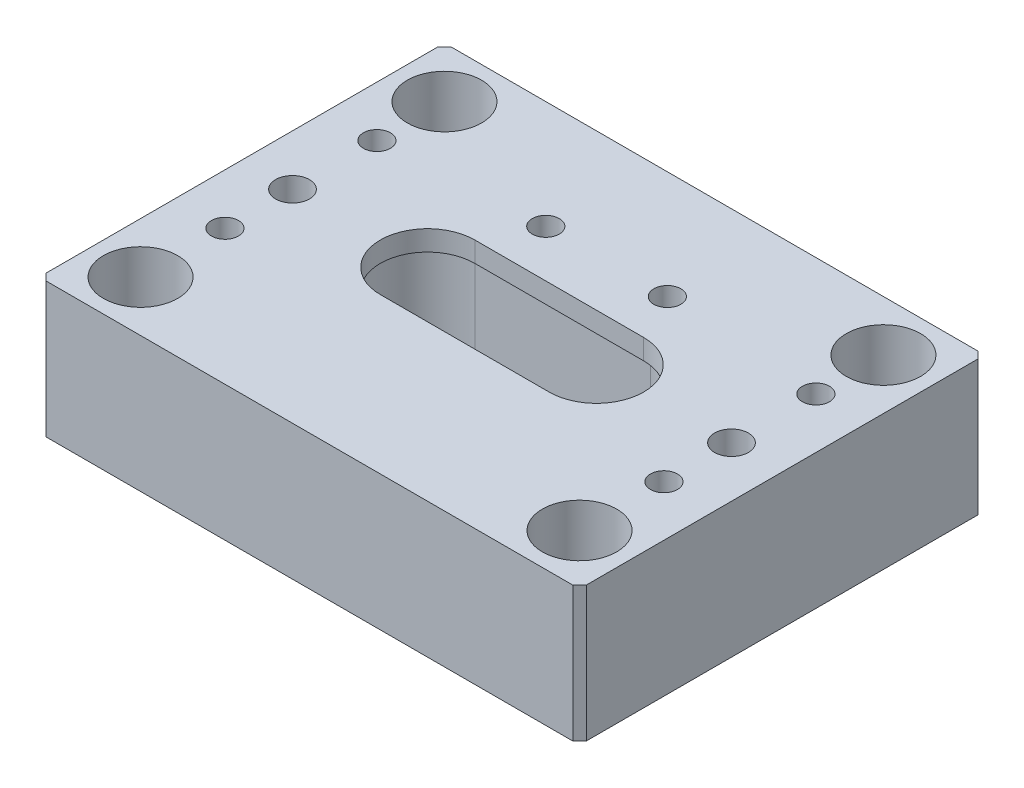
ISO-10303-21;
HEADER;
FILE_DESCRIPTION(('STEP AP214'),'2;1');
FILE_NAME('part.step','',(''),(''),'','','');
FILE_SCHEMA(('AUTOMOTIVE_DESIGN { 1 0 10303 214 1 1 1 1 }'));
ENDSEC;
DATA;
#1=APPLICATION_CONTEXT('core data for automotive mechanical design processes');
#2=APPLICATION_PROTOCOL_DEFINITION('international standard','automotive_design',2000,#1);
#3=PRODUCT_CONTEXT('',#1,'mechanical');
#4=PRODUCT('Part','Part','',(#3));
#5=PRODUCT_RELATED_PRODUCT_CATEGORY('part','',(#4));
#6=PRODUCT_DEFINITION_FORMATION('','',#4);
#7=PRODUCT_DEFINITION_CONTEXT('part definition',#1,'design');
#8=PRODUCT_DEFINITION('design','',#6,#7);
#9=PRODUCT_DEFINITION_SHAPE('','',#8);
#10=(LENGTH_UNIT() NAMED_UNIT(*) SI_UNIT(.MILLI.,.METRE.));
#11=(NAMED_UNIT(*) PLANE_ANGLE_UNIT() SI_UNIT($,.RADIAN.));
#12=(NAMED_UNIT(*) SI_UNIT($,.STERADIAN.) SOLID_ANGLE_UNIT());
#13=UNCERTAINTY_MEASURE_WITH_UNIT(LENGTH_MEASURE(1.E-05),#10,'distance_accuracy_value','');
#14=(GEOMETRIC_REPRESENTATION_CONTEXT(3) GLOBAL_UNCERTAINTY_ASSIGNED_CONTEXT((#13)) GLOBAL_UNIT_ASSIGNED_CONTEXT((#10,
#11,#12)) REPRESENTATION_CONTEXT('',''));
#15=CARTESIAN_POINT('',(0.,0.,0.));
#16=DIRECTION('',(0.,0.,1.));
#17=DIRECTION('',(1.,0.,0.));
#18=AXIS2_PLACEMENT_3D('',#15,#16,#17);
#19=CARTESIAN_POINT('',(-40.,20.,-29.));
#20=DIRECTION('',(-0.707106781186548,0.,-0.707106781186548));
#21=DIRECTION('',(-0.707106781186548,0.,0.707106781186548));
#22=AXIS2_PLACEMENT_3D('',#19,#20,#21);
#23=PLANE('',#22);
#24=DIRECTION('',(0.707106781186547,0.,-0.707106781186547));
#25=VECTOR('',#24,1.);
#26=CARTESIAN_POINT('',(-40.,0.,-29.));
#27=LINE('',#26,#25);
#28=CARTESIAN_POINT('',(-40.,0.,-29.));
#29=VERTEX_POINT('',#28);
#30=CARTESIAN_POINT('',(-39.,0.,-30.));
#31=VERTEX_POINT('',#30);
#32=EDGE_CURVE('E261',#29,#31,#27,.T.);
#33=ORIENTED_EDGE('',*,*,#32,.F.);
#34=DIRECTION('',(0.,-1.,0.));
#35=VECTOR('',#34,1.);
#36=CARTESIAN_POINT('',(-40.,20.,-29.));
#37=LINE('',#36,#35);
#38=CARTESIAN_POINT('',(-40.,20.,-29.));
#39=VERTEX_POINT('',#38);
#40=EDGE_CURVE('E11',#39,#29,#37,.T.);
#41=ORIENTED_EDGE('',*,*,#40,.F.);
#42=DIRECTION('',(0.707106781186547,0.,-0.707106781186547));
#43=VECTOR('',#42,1.);
#44=CARTESIAN_POINT('',(-40.,20.,-29.));
#45=LINE('',#44,#43);
#46=CARTESIAN_POINT('',(-39.,20.,-30.));
#47=VERTEX_POINT('',#46);
#48=EDGE_CURVE('E270',#39,#47,#45,.T.);
#49=ORIENTED_EDGE('',*,*,#48,.T.);
#50=DIRECTION('',(0.,-1.,0.));
#51=VECTOR('',#50,1.);
#52=CARTESIAN_POINT('',(-39.,20.,-30.));
#53=LINE('',#52,#51);
#54=EDGE_CURVE('E46',#47,#31,#53,.T.);
#55=ORIENTED_EDGE('',*,*,#54,.T.);
#56=EDGE_LOOP('',(#33,#41,#49,#55));
#57=FACE_BOUND('',#56,.T.);
#58=ADVANCED_FACE('F43',(#57),#23,.T.);
#59=CARTESIAN_POINT('',(-40.,20.,-29.));
#60=DIRECTION('',(1.,0.,0.));
#61=DIRECTION('',(0.,0.,-1.));
#62=AXIS2_PLACEMENT_3D('',#59,#60,#61);
#63=PLANE('',#62);
#64=DIRECTION('',(0.,0.,1.));
#65=VECTOR('',#64,1.);
#66=CARTESIAN_POINT('',(-40.,0.,-29.));
#67=LINE('',#66,#65);
#68=CARTESIAN_POINT('',(-40.,0.,29.));
#69=VERTEX_POINT('',#68);
#70=EDGE_CURVE('E275',#29,#69,#67,.T.);
#71=ORIENTED_EDGE('',*,*,#70,.T.);
#72=DIRECTION('',(0.,-1.,0.));
#73=VECTOR('',#72,1.);
#74=CARTESIAN_POINT('',(-40.,20.,29.));
#75=LINE('',#74,#73);
#76=CARTESIAN_POINT('',(-40.,20.,29.));
#77=VERTEX_POINT('',#76);
#78=EDGE_CURVE('E52',#77,#69,#75,.T.);
#79=ORIENTED_EDGE('',*,*,#78,.F.);
#80=DIRECTION('',(0.,0.,1.));
#81=VECTOR('',#80,1.);
#82=CARTESIAN_POINT('',(-40.,20.,-29.));
#83=LINE('',#82,#81);
#84=EDGE_CURVE('E296',#39,#77,#83,.T.);
#85=ORIENTED_EDGE('',*,*,#84,.F.);
#86=ORIENTED_EDGE('',*,*,#40,.T.);
#87=EDGE_LOOP('',(#71,#79,#85,#86));
#88=FACE_BOUND('',#87,.T.);
#89=ADVANCED_FACE('F360',(#88),#63,.F.);
#90=CARTESIAN_POINT('',(-40.,20.,29.));
#91=DIRECTION('',(0.707106781186548,0.,-0.707106781186548));
#92=DIRECTION('',(-0.707106781186548,0.,-0.707106781186548));
#93=AXIS2_PLACEMENT_3D('',#90,#91,#92);
#94=PLANE('',#93);
#95=DIRECTION('',(0.707106781186547,0.,0.707106781186547));
#96=VECTOR('',#95,1.);
#97=CARTESIAN_POINT('',(-40.,0.,29.));
#98=LINE('',#97,#96);
#99=CARTESIAN_POINT('',(-39.,0.,30.));
#100=VERTEX_POINT('',#99);
#101=EDGE_CURVE('E321',#69,#100,#98,.T.);
#102=ORIENTED_EDGE('',*,*,#101,.T.);
#103=DIRECTION('',(0.,-1.,0.));
#104=VECTOR('',#103,1.);
#105=CARTESIAN_POINT('',(-39.,20.,30.));
#106=LINE('',#105,#104);
#107=CARTESIAN_POINT('',(-39.,20.,30.));
#108=VERTEX_POINT('',#107);
#109=EDGE_CURVE('E329',#108,#100,#106,.T.);
#110=ORIENTED_EDGE('',*,*,#109,.F.);
#111=DIRECTION('',(0.707106781186547,0.,0.707106781186547));
#112=VECTOR('',#111,1.);
#113=CARTESIAN_POINT('',(-40.,20.,29.));
#114=LINE('',#113,#112);
#115=EDGE_CURVE('E293',#77,#108,#114,.T.);
#116=ORIENTED_EDGE('',*,*,#115,.F.);
#117=ORIENTED_EDGE('',*,*,#78,.T.);
#118=EDGE_LOOP('',(#102,#110,#116,#117));
#119=FACE_BOUND('',#118,.T.);
#120=ADVANCED_FACE('F364',(#119),#94,.F.);
#121=CARTESIAN_POINT('',(-39.,20.,30.));
#122=DIRECTION('',(0.,0.,-1.));
#123=DIRECTION('',(-1.,0.,0.));
#124=AXIS2_PLACEMENT_3D('',#121,#122,#123);
#125=PLANE('',#124);
#126=DIRECTION('',(1.,0.,0.));
#127=VECTOR('',#126,1.);
#128=CARTESIAN_POINT('',(-39.,0.,30.));
#129=LINE('',#128,#127);
#130=CARTESIAN_POINT('',(39.,0.,30.));
#131=VERTEX_POINT('',#130);
#132=EDGE_CURVE('E318',#100,#131,#129,.T.);
#133=ORIENTED_EDGE('',*,*,#132,.T.);
#134=DIRECTION('',(0.,-1.,0.));
#135=VECTOR('',#134,1.);
#136=CARTESIAN_POINT('',(39.,20.,30.));
#137=LINE('',#136,#135);
#138=CARTESIAN_POINT('',(39.,20.,30.));
#139=VERTEX_POINT('',#138);
#140=EDGE_CURVE('E333',#139,#131,#137,.T.);
#141=ORIENTED_EDGE('',*,*,#140,.F.);
#142=DIRECTION('',(1.,0.,0.));
#143=VECTOR('',#142,1.);
#144=CARTESIAN_POINT('',(-39.,20.,30.));
#145=LINE('',#144,#143);
#146=EDGE_CURVE('E290',#108,#139,#145,.T.);
#147=ORIENTED_EDGE('',*,*,#146,.F.);
#148=ORIENTED_EDGE('',*,*,#109,.T.);
#149=EDGE_LOOP('',(#133,#141,#147,#148));
#150=FACE_BOUND('',#149,.T.);
#151=ADVANCED_FACE('F383',(#150),#125,.F.);
#152=CARTESIAN_POINT('',(39.,20.,30.));
#153=DIRECTION('',(-0.707106781186548,0.,-0.707106781186548));
#154=DIRECTION('',(-0.707106781186548,0.,0.707106781186548));
#155=AXIS2_PLACEMENT_3D('',#152,#153,#154);
#156=PLANE('',#155);
#157=DIRECTION('',(0.707106781186547,0.,-0.707106781186547));
#158=VECTOR('',#157,1.);
#159=CARTESIAN_POINT('',(39.,0.,30.));
#160=LINE('',#159,#158);
#161=CARTESIAN_POINT('',(40.,0.,29.));
#162=VERTEX_POINT('',#161);
#163=EDGE_CURVE('E314',#131,#162,#160,.T.);
#164=ORIENTED_EDGE('',*,*,#163,.T.);
#165=DIRECTION('',(0.,-1.,0.));
#166=VECTOR('',#165,1.);
#167=CARTESIAN_POINT('',(40.,20.,29.));
#168=LINE('',#167,#166);
#169=CARTESIAN_POINT('',(40.,20.,29.));
#170=VERTEX_POINT('',#169);
#171=EDGE_CURVE('E337',#170,#162,#168,.T.);
#172=ORIENTED_EDGE('',*,*,#171,.F.);
#173=DIRECTION('',(0.707106781186547,0.,-0.707106781186547));
#174=VECTOR('',#173,1.);
#175=CARTESIAN_POINT('',(39.,20.,30.));
#176=LINE('',#175,#174);
#177=EDGE_CURVE('E287',#139,#170,#176,.T.);
#178=ORIENTED_EDGE('',*,*,#177,.F.);
#179=ORIENTED_EDGE('',*,*,#140,.T.);
#180=EDGE_LOOP('',(#164,#172,#178,#179));
#181=FACE_BOUND('',#180,.T.);
#182=ADVANCED_FACE('F381',(#181),#156,.F.);
#183=CARTESIAN_POINT('',(40.,20.,-29.));
#184=DIRECTION('',(1.,0.,0.));
#185=DIRECTION('',(0.,0.,-1.));
#186=AXIS2_PLACEMENT_3D('',#183,#184,#185);
#187=PLANE('',#186);
#188=DIRECTION('',(0.,0.,1.));
#189=VECTOR('',#188,1.);
#190=CARTESIAN_POINT('',(40.,0.,-29.));
#191=LINE('',#190,#189);
#192=CARTESIAN_POINT('',(40.,0.,-29.));
#193=VERTEX_POINT('',#192);
#194=EDGE_CURVE('E310',#193,#162,#191,.T.);
#195=ORIENTED_EDGE('',*,*,#194,.F.);
#196=DIRECTION('',(0.,-1.,0.));
#197=VECTOR('',#196,1.);
#198=CARTESIAN_POINT('',(40.,20.,-29.));
#199=LINE('',#198,#197);
#200=CARTESIAN_POINT('',(40.,20.,-29.));
#201=VERTEX_POINT('',#200);
#202=EDGE_CURVE('E340',#201,#193,#199,.T.);
#203=ORIENTED_EDGE('',*,*,#202,.F.);
#204=DIRECTION('',(0.,0.,1.));
#205=VECTOR('',#204,1.);
#206=CARTESIAN_POINT('',(40.,20.,-29.));
#207=LINE('',#206,#205);
#208=EDGE_CURVE('E283',#201,#170,#207,.T.);
#209=ORIENTED_EDGE('',*,*,#208,.T.);
#210=ORIENTED_EDGE('',*,*,#171,.T.);
#211=EDGE_LOOP('',(#195,#203,#209,#210));
#212=FACE_BOUND('',#211,.T.);
#213=ADVANCED_FACE('F377',(#212),#187,.T.);
#214=CARTESIAN_POINT('',(39.,20.,-30.));
#215=DIRECTION('',(0.707106781186548,0.,-0.707106781186548));
#216=DIRECTION('',(-0.707106781186548,0.,-0.707106781186548));
#217=AXIS2_PLACEMENT_3D('',#214,#215,#216);
#218=PLANE('',#217);
#219=DIRECTION('',(0.707106781186547,0.,0.707106781186547));
#220=VECTOR('',#219,1.);
#221=CARTESIAN_POINT('',(39.,0.,-30.));
#222=LINE('',#221,#220);
#223=CARTESIAN_POINT('',(39.,0.,-30.));
#224=VERTEX_POINT('',#223);
#225=EDGE_CURVE('E306',#224,#193,#222,.T.);
#226=ORIENTED_EDGE('',*,*,#225,.F.);
#227=DIRECTION('',(0.,-1.,0.));
#228=VECTOR('',#227,1.);
#229=CARTESIAN_POINT('',(39.,20.,-30.));
#230=LINE('',#229,#228);
#231=CARTESIAN_POINT('',(39.,20.,-30.));
#232=VERTEX_POINT('',#231);
#233=EDGE_CURVE('E342',#232,#224,#230,.T.);
#234=ORIENTED_EDGE('',*,*,#233,.F.);
#235=DIRECTION('',(0.707106781186547,0.,0.707106781186547));
#236=VECTOR('',#235,1.);
#237=CARTESIAN_POINT('',(39.,20.,-30.));
#238=LINE('',#237,#236);
#239=EDGE_CURVE('E279',#232,#201,#238,.T.);
#240=ORIENTED_EDGE('',*,*,#239,.T.);
#241=ORIENTED_EDGE('',*,*,#202,.T.);
#242=EDGE_LOOP('',(#226,#234,#240,#241));
#243=FACE_BOUND('',#242,.T.);
#244=ADVANCED_FACE('F373',(#243),#218,.T.);
#245=CARTESIAN_POINT('',(-39.,20.,-30.));
#246=DIRECTION('',(0.,0.,-1.));
#247=DIRECTION('',(-1.,0.,0.));
#248=AXIS2_PLACEMENT_3D('',#245,#246,#247);
#249=PLANE('',#248);
#250=DIRECTION('',(1.,0.,0.));
#251=VECTOR('',#250,1.);
#252=CARTESIAN_POINT('',(-39.,0.,-30.));
#253=LINE('',#252,#251);
#254=EDGE_CURVE('E302',#31,#224,#253,.T.);
#255=ORIENTED_EDGE('',*,*,#254,.F.);
#256=ORIENTED_EDGE('',*,*,#54,.F.);
#257=DIRECTION('',(1.,0.,0.));
#258=VECTOR('',#257,1.);
#259=CARTESIAN_POINT('',(-39.,20.,-30.));
#260=LINE('',#259,#258);
#261=EDGE_CURVE('E274',#47,#232,#260,.T.);
#262=ORIENTED_EDGE('',*,*,#261,.T.);
#263=ORIENTED_EDGE('',*,*,#233,.T.);
#264=EDGE_LOOP('',(#255,#256,#262,#263));
#265=FACE_BOUND('',#264,.T.);
#266=ADVANCED_FACE('F352',(#265),#249,.T.);
#267=CARTESIAN_POINT('',(0.,20.,0.));
#268=DIRECTION('',(0.,-1.,0.));
#269=DIRECTION('',(0.,0.,-1.));
#270=AXIS2_PLACEMENT_3D('',#267,#268,#269);
#271=PLANE('',#270);
#272=CARTESIAN_POINT('',(32.5,20.,-12.5));
#273=DIRECTION('',(0.,1.,0.));
#274=DIRECTION('',(0.,0.,1.));
#275=AXIS2_PLACEMENT_3D('',#272,#273,#274);
#276=CIRCLE('',#275,1.99999999999999);
#277=CARTESIAN_POINT('',(32.5,20.,-10.5));
#278=VERTEX_POINT('',#277);
#279=EDGE_CURVE('E528',#278,#278,#276,.T.);
#280=ORIENTED_EDGE('',*,*,#279,.F.);
#281=EDGE_LOOP('',(#280));
#282=FACE_BOUND('',#281,.T.);
#283=CARTESIAN_POINT('',(32.5000000000002,20.,10.));
#284=DIRECTION('',(0.,1.,0.));
#285=DIRECTION('',(0.,0.,1.));
#286=AXIS2_PLACEMENT_3D('',#283,#284,#285);
#287=CIRCLE('',#286,1.99999999999999);
#288=CARTESIAN_POINT('',(32.5000000000002,20.,12.));
#289=VERTEX_POINT('',#288);
#290=EDGE_CURVE('E532',#289,#289,#287,.T.);
#291=ORIENTED_EDGE('',*,*,#290,.F.);
#292=EDGE_LOOP('',(#291));
#293=FACE_BOUND('',#292,.T.);
#294=CARTESIAN_POINT('',(-32.5,20.,10.));
#295=DIRECTION('',(0.,1.,0.));
#296=DIRECTION('',(0.,0.,1.));
#297=AXIS2_PLACEMENT_3D('',#294,#295,#296);
#298=CIRCLE('',#297,2.);
#299=CARTESIAN_POINT('',(-32.5,20.,12.));
#300=VERTEX_POINT('',#299);
#301=EDGE_CURVE('E542',#300,#300,#298,.T.);
#302=ORIENTED_EDGE('',*,*,#301,.F.);
#303=EDGE_LOOP('',(#302));
#304=FACE_BOUND('',#303,.T.);
#305=CARTESIAN_POINT('',(-32.5,20.,-12.5));
#306=DIRECTION('',(0.,1.,0.));
#307=DIRECTION('',(0.,0.,1.));
#308=AXIS2_PLACEMENT_3D('',#305,#306,#307);
#309=CIRCLE('',#308,2.);
#310=CARTESIAN_POINT('',(-32.5,20.,-10.5));
#311=VERTEX_POINT('',#310);
#312=EDGE_CURVE('E550',#311,#311,#309,.T.);
#313=ORIENTED_EDGE('',*,*,#312,.F.);
#314=EDGE_LOOP('',(#313));
#315=FACE_BOUND('',#314,.T.);
#316=CARTESIAN_POINT('',(-32.5,20.,22.5000000000005));
#317=DIRECTION('',(0.,1.,0.));
#318=DIRECTION('',(0.,0.,1.));
#319=AXIS2_PLACEMENT_3D('',#316,#317,#318);
#320=CIRCLE('',#319,5.5);
#321=CARTESIAN_POINT('',(-32.5,20.,28.0000000000005));
#322=VERTEX_POINT('',#321);
#323=EDGE_CURVE('E558',#322,#322,#320,.T.);
#324=ORIENTED_EDGE('',*,*,#323,.F.);
#325=EDGE_LOOP('',(#324));
#326=FACE_BOUND('',#325,.T.);
#327=CARTESIAN_POINT('',(-32.5,20.,-22.5));
#328=DIRECTION('',(0.,1.,0.));
#329=DIRECTION('',(0.,0.,1.));
#330=AXIS2_PLACEMENT_3D('',#327,#328,#329);
#331=CIRCLE('',#330,5.5);
#332=CARTESIAN_POINT('',(-32.5,20.,-17.));
#333=VERTEX_POINT('',#332);
#334=EDGE_CURVE('E574',#333,#333,#331,.T.);
#335=ORIENTED_EDGE('',*,*,#334,.F.);
#336=EDGE_LOOP('',(#335));
#337=FACE_BOUND('',#336,.T.);
#338=CARTESIAN_POINT('',(32.5,20.,-22.5));
#339=DIRECTION('',(0.,1.,0.));
#340=DIRECTION('',(0.,0.,1.));
#341=AXIS2_PLACEMENT_3D('',#338,#339,#340);
#342=CIRCLE('',#341,5.5);
#343=CARTESIAN_POINT('',(32.5,20.,-17.));
#344=VERTEX_POINT('',#343);
#345=EDGE_CURVE('E590',#344,#344,#342,.T.);
#346=ORIENTED_EDGE('',*,*,#345,.F.);
#347=EDGE_LOOP('',(#346));
#348=FACE_BOUND('',#347,.T.);
#349=CARTESIAN_POINT('',(32.5,20.,22.5));
#350=DIRECTION('',(0.,1.,0.));
#351=DIRECTION('',(0.,0.,1.));
#352=AXIS2_PLACEMENT_3D('',#349,#350,#351);
#353=CIRCLE('',#352,5.5);
#354=CARTESIAN_POINT('',(32.5,20.,28.));
#355=VERTEX_POINT('',#354);
#356=EDGE_CURVE('E606',#355,#355,#353,.T.);
#357=ORIENTED_EDGE('',*,*,#356,.F.);
#358=EDGE_LOOP('',(#357));
#359=FACE_BOUND('',#358,.T.);
#360=CARTESIAN_POINT('',(-32.5,20.,4.67770361857422E-13));
#361=DIRECTION('',(0.,1.,0.));
#362=DIRECTION('',(0.,0.,1.));
#363=AXIS2_PLACEMENT_3D('',#360,#361,#362);
#364=CIRCLE('',#363,2.49999999999999);
#365=CARTESIAN_POINT('',(-32.5,20.,2.50000000000046));
#366=VERTEX_POINT('',#365);
#367=EDGE_CURVE('E622',#366,#366,#364,.T.);
#368=ORIENTED_EDGE('',*,*,#367,.F.);
#369=EDGE_LOOP('',(#368));
#370=FACE_BOUND('',#369,.T.);
#371=CARTESIAN_POINT('',(32.5,20.,0.));
#372=DIRECTION('',(0.,1.,0.));
#373=DIRECTION('',(0.,0.,1.));
#374=AXIS2_PLACEMENT_3D('',#371,#372,#373);
#375=CIRCLE('',#374,2.49999999999999);
#376=CARTESIAN_POINT('',(32.5,20.,2.5));
#377=VERTEX_POINT('',#376);
#378=EDGE_CURVE('E630',#377,#377,#375,.T.);
#379=ORIENTED_EDGE('',*,*,#378,.F.);
#380=EDGE_LOOP('',(#379));
#381=FACE_BOUND('',#380,.T.);
#382=CARTESIAN_POINT('',(9.00000000000002,20.,-14.));
#383=DIRECTION('',(0.,1.,0.));
#384=DIRECTION('',(0.,0.,1.));
#385=AXIS2_PLACEMENT_3D('',#382,#383,#384);
#386=CIRCLE('',#385,2.);
#387=CARTESIAN_POINT('',(9.00000000000002,20.,-12.));
#388=VERTEX_POINT('',#387);
#389=EDGE_CURVE('E174',#388,#388,#386,.T.);
#390=ORIENTED_EDGE('',*,*,#389,.F.);
#391=EDGE_LOOP('',(#390));
#392=FACE_BOUND('',#391,.T.);
#393=CARTESIAN_POINT('',(-8.99999999999997,20.,-14.));
#394=DIRECTION('',(0.,1.,0.));
#395=DIRECTION('',(0.,0.,1.));
#396=AXIS2_PLACEMENT_3D('',#393,#394,#395);
#397=CIRCLE('',#396,2.);
#398=CARTESIAN_POINT('',(-8.99999999999997,20.,-12.));
#399=VERTEX_POINT('',#398);
#400=EDGE_CURVE('E173',#399,#399,#397,.T.);
#401=ORIENTED_EDGE('',*,*,#400,.F.);
#402=EDGE_LOOP('',(#401));
#403=FACE_BOUND('',#402,.T.);
#404=DIRECTION('',(-1.,0.,0.));
#405=VECTOR('',#404,1.);
#406=CARTESIAN_POINT('',(-12.5,20.,-7.));
#407=LINE('',#406,#405);
#408=CARTESIAN_POINT('',(12.5,20.,-7.));
#409=VERTEX_POINT('',#408);
#410=CARTESIAN_POINT('',(-12.5,20.,-7.));
#411=VERTEX_POINT('',#410);
#412=EDGE_CURVE('E247',#409,#411,#407,.T.);
#413=ORIENTED_EDGE('',*,*,#412,.F.);
#414=CARTESIAN_POINT('',(12.5,20.,0.));
#415=DIRECTION('',(0.,1.,0.));
#416=DIRECTION('',(0.,0.,1.));
#417=AXIS2_PLACEMENT_3D('',#414,#415,#416);
#418=CIRCLE('',#417,7.);
#419=CARTESIAN_POINT('',(12.5,20.,7.));
#420=VERTEX_POINT('',#419);
#421=EDGE_CURVE('E68',#420,#409,#418,.T.);
#422=ORIENTED_EDGE('',*,*,#421,.F.);
#423=DIRECTION('',(1.,0.,0.));
#424=VECTOR('',#423,1.);
#425=CARTESIAN_POINT('',(-12.5,20.,7.));
#426=LINE('',#425,#424);
#427=CARTESIAN_POINT('',(-12.5,20.,7.));
#428=VERTEX_POINT('',#427);
#429=EDGE_CURVE('E235',#428,#420,#426,.T.);
#430=ORIENTED_EDGE('',*,*,#429,.F.);
#431=CARTESIAN_POINT('',(-12.5,20.,0.));
#432=DIRECTION('',(0.,1.,0.));
#433=DIRECTION('',(0.,0.,1.));
#434=AXIS2_PLACEMENT_3D('',#431,#432,#433);
#435=CIRCLE('',#434,7.);
#436=EDGE_CURVE('E251',#411,#428,#435,.T.);
#437=ORIENTED_EDGE('',*,*,#436,.F.);
#438=EDGE_LOOP('',(#413,#422,#430,#437));
#439=FACE_BOUND('',#438,.T.);
#440=ORIENTED_EDGE('',*,*,#48,.F.);
#441=ORIENTED_EDGE('',*,*,#84,.T.);
#442=ORIENTED_EDGE('',*,*,#115,.T.);
#443=ORIENTED_EDGE('',*,*,#146,.T.);
#444=ORIENTED_EDGE('',*,*,#177,.T.);
#445=ORIENTED_EDGE('',*,*,#208,.F.);
#446=ORIENTED_EDGE('',*,*,#239,.F.);
#447=ORIENTED_EDGE('',*,*,#261,.F.);
#448=EDGE_LOOP('',(#440,#441,#442,#443,#444,#445,#446,#447));
#449=FACE_BOUND('',#448,.T.);
#450=ADVANCED_FACE('F368',(#282,#293,#304,#315,#326,#337,#348,#359,#370,#381,#392,#403,#439,
#449),#271,.F.);
#451=CARTESIAN_POINT('',(0.,0.,0.));
#452=DIRECTION('',(0.,-1.,0.));
#453=DIRECTION('',(0.,0.,-1.));
#454=AXIS2_PLACEMENT_3D('',#451,#452,#453);
#455=PLANE('',#454);
#456=CARTESIAN_POINT('',(32.5,0.,-12.5));
#457=DIRECTION('',(0.,1.,0.));
#458=DIRECTION('',(0.,0.,1.));
#459=AXIS2_PLACEMENT_3D('',#456,#457,#458);
#460=CIRCLE('',#459,1.99999999999999);
#461=CARTESIAN_POINT('',(32.5,0.,-10.5));
#462=VERTEX_POINT('',#461);
#463=EDGE_CURVE('E525',#462,#462,#460,.T.);
#464=ORIENTED_EDGE('',*,*,#463,.T.);
#465=EDGE_LOOP('',(#464));
#466=FACE_BOUND('',#465,.T.);
#467=CARTESIAN_POINT('',(32.5000000000002,0.,10.));
#468=DIRECTION('',(0.,1.,0.));
#469=DIRECTION('',(0.,0.,1.));
#470=AXIS2_PLACEMENT_3D('',#467,#468,#469);
#471=CIRCLE('',#470,1.99999999999999);
#472=CARTESIAN_POINT('',(32.5000000000002,0.,12.));
#473=VERTEX_POINT('',#472);
#474=EDGE_CURVE('E538',#473,#473,#471,.T.);
#475=ORIENTED_EDGE('',*,*,#474,.T.);
#476=EDGE_LOOP('',(#475));
#477=FACE_BOUND('',#476,.T.);
#478=CARTESIAN_POINT('',(-32.5,0.,10.));
#479=DIRECTION('',(0.,1.,0.));
#480=DIRECTION('',(0.,0.,1.));
#481=AXIS2_PLACEMENT_3D('',#478,#479,#480);
#482=CIRCLE('',#481,1.99999999999999);
#483=CARTESIAN_POINT('',(-32.5,0.,12.));
#484=VERTEX_POINT('',#483);
#485=EDGE_CURVE('E546',#484,#484,#482,.T.);
#486=ORIENTED_EDGE('',*,*,#485,.T.);
#487=EDGE_LOOP('',(#486));
#488=FACE_BOUND('',#487,.T.);
#489=CARTESIAN_POINT('',(-32.5,0.,-12.5));
#490=DIRECTION('',(0.,1.,0.));
#491=DIRECTION('',(0.,0.,1.));
#492=AXIS2_PLACEMENT_3D('',#489,#490,#491);
#493=CIRCLE('',#492,1.99999999999999);
#494=CARTESIAN_POINT('',(-32.5,0.,-10.5));
#495=VERTEX_POINT('',#494);
#496=EDGE_CURVE('E554',#495,#495,#493,.T.);
#497=ORIENTED_EDGE('',*,*,#496,.T.);
#498=EDGE_LOOP('',(#497));
#499=FACE_BOUND('',#498,.T.);
#500=CARTESIAN_POINT('',(-32.5,0.,22.5000000000005));
#501=DIRECTION('',(0.,1.,0.));
#502=DIRECTION('',(0.,0.,1.));
#503=AXIS2_PLACEMENT_3D('',#500,#501,#502);
#504=CIRCLE('',#503,3.29999999999999);
#505=CARTESIAN_POINT('',(-32.5,0.,25.8000000000005));
#506=VERTEX_POINT('',#505);
#507=EDGE_CURVE('E570',#506,#506,#504,.T.);
#508=ORIENTED_EDGE('',*,*,#507,.T.);
#509=EDGE_LOOP('',(#508));
#510=FACE_BOUND('',#509,.T.);
#511=CARTESIAN_POINT('',(-32.5,0.,-22.5));
#512=DIRECTION('',(0.,1.,0.));
#513=DIRECTION('',(0.,0.,1.));
#514=AXIS2_PLACEMENT_3D('',#511,#512,#513);
#515=CIRCLE('',#514,3.29999999999999);
#516=CARTESIAN_POINT('',(-32.5,0.,-19.2));
#517=VERTEX_POINT('',#516);
#518=EDGE_CURVE('E586',#517,#517,#515,.T.);
#519=ORIENTED_EDGE('',*,*,#518,.T.);
#520=EDGE_LOOP('',(#519));
#521=FACE_BOUND('',#520,.T.);
#522=CARTESIAN_POINT('',(32.5,0.,-22.5));
#523=DIRECTION('',(0.,1.,0.));
#524=DIRECTION('',(0.,0.,1.));
#525=AXIS2_PLACEMENT_3D('',#522,#523,#524);
#526=CIRCLE('',#525,3.3);
#527=CARTESIAN_POINT('',(32.5,0.,-19.2));
#528=VERTEX_POINT('',#527);
#529=EDGE_CURVE('E602',#528,#528,#526,.T.);
#530=ORIENTED_EDGE('',*,*,#529,.T.);
#531=EDGE_LOOP('',(#530));
#532=FACE_BOUND('',#531,.T.);
#533=CARTESIAN_POINT('',(32.5,0.,22.5));
#534=DIRECTION('',(0.,1.,0.));
#535=DIRECTION('',(0.,0.,1.));
#536=AXIS2_PLACEMENT_3D('',#533,#534,#535);
#537=CIRCLE('',#536,3.3);
#538=CARTESIAN_POINT('',(32.5,0.,25.8));
#539=VERTEX_POINT('',#538);
#540=EDGE_CURVE('E618',#539,#539,#537,.T.);
#541=ORIENTED_EDGE('',*,*,#540,.T.);
#542=EDGE_LOOP('',(#541));
#543=FACE_BOUND('',#542,.T.);
#544=CARTESIAN_POINT('',(-32.5,0.,4.67770361857422E-13));
#545=DIRECTION('',(0.,1.,0.));
#546=DIRECTION('',(0.,0.,1.));
#547=AXIS2_PLACEMENT_3D('',#544,#545,#546);
#548=CIRCLE('',#547,2.5);
#549=CARTESIAN_POINT('',(-32.5,0.,2.50000000000046));
#550=VERTEX_POINT('',#549);
#551=EDGE_CURVE('E626',#550,#550,#548,.T.);
#552=ORIENTED_EDGE('',*,*,#551,.T.);
#553=EDGE_LOOP('',(#552));
#554=FACE_BOUND('',#553,.T.);
#555=CARTESIAN_POINT('',(32.5,0.,0.));
#556=DIRECTION('',(0.,1.,0.));
#557=DIRECTION('',(0.,0.,1.));
#558=AXIS2_PLACEMENT_3D('',#555,#556,#557);
#559=CIRCLE('',#558,2.5);
#560=CARTESIAN_POINT('',(32.5,0.,2.50000000000001));
#561=VERTEX_POINT('',#560);
#562=EDGE_CURVE('E182',#561,#561,#559,.T.);
#563=ORIENTED_EDGE('',*,*,#562,.T.);
#564=EDGE_LOOP('',(#563));
#565=FACE_BOUND('',#564,.T.);
#566=CARTESIAN_POINT('',(13.,0.,0.));
#567=DIRECTION('',(0.,-1.,0.));
#568=DIRECTION('',(0.,0.,-1.));
#569=AXIS2_PLACEMENT_3D('',#566,#567,#568);
#570=CIRCLE('',#569,7.5);
#571=CARTESIAN_POINT('',(13.,0.,-7.5));
#572=VERTEX_POINT('',#571);
#573=CARTESIAN_POINT('',(13.,0.,7.5));
#574=VERTEX_POINT('',#573);
#575=EDGE_CURVE('E60',#572,#574,#570,.T.);
#576=ORIENTED_EDGE('',*,*,#575,.F.);
#577=DIRECTION('',(1.,0.,0.));
#578=VECTOR('',#577,1.);
#579=CARTESIAN_POINT('',(-13.,0.,-7.5));
#580=LINE('',#579,#578);
#581=CARTESIAN_POINT('',(-13.,0.,-7.5));
#582=VERTEX_POINT('',#581);
#583=EDGE_CURVE('E194',#582,#572,#580,.T.);
#584=ORIENTED_EDGE('',*,*,#583,.F.);
#585=CARTESIAN_POINT('',(-13.,0.,0.));
#586=DIRECTION('',(0.,-1.,0.));
#587=DIRECTION('',(0.,0.,-1.));
#588=AXIS2_PLACEMENT_3D('',#585,#586,#587);
#589=CIRCLE('',#588,7.5);
#590=CARTESIAN_POINT('',(-13.,0.,7.5));
#591=VERTEX_POINT('',#590);
#592=EDGE_CURVE('E213',#591,#582,#589,.T.);
#593=ORIENTED_EDGE('',*,*,#592,.F.);
#594=DIRECTION('',(-1.,0.,0.));
#595=VECTOR('',#594,1.);
#596=CARTESIAN_POINT('',(-13.,0.,7.5));
#597=LINE('',#596,#595);
#598=EDGE_CURVE('E209',#574,#591,#597,.T.);
#599=ORIENTED_EDGE('',*,*,#598,.F.);
#600=EDGE_LOOP('',(#576,#584,#593,#599));
#601=FACE_BOUND('',#600,.T.);
#602=ORIENTED_EDGE('',*,*,#32,.T.);
#603=ORIENTED_EDGE('',*,*,#254,.T.);
#604=ORIENTED_EDGE('',*,*,#225,.T.);
#605=ORIENTED_EDGE('',*,*,#194,.T.);
#606=ORIENTED_EDGE('',*,*,#163,.F.);
#607=ORIENTED_EDGE('',*,*,#132,.F.);
#608=ORIENTED_EDGE('',*,*,#101,.F.);
#609=ORIENTED_EDGE('',*,*,#70,.F.);
#610=EDGE_LOOP('',(#602,#603,#604,#605,#606,#607,#608,#609));
#611=FACE_BOUND('',#610,.T.);
#612=ADVANCED_FACE('F355',(#466,#477,#488,#499,#510,#521,#532,#543,#554,#565,#601,#611),#455,.T.);
#613=CARTESIAN_POINT('',(12.5,17.,0.));
#614=DIRECTION('',(0.,1.,0.));
#615=DIRECTION('',(0.,0.,1.));
#616=AXIS2_PLACEMENT_3D('',#613,#614,#615);
#617=CYLINDRICAL_SURFACE('',#616,7.);
#618=ORIENTED_EDGE('',*,*,#421,.T.);
#619=DIRECTION('',(0.,1.,0.));
#620=VECTOR('',#619,1.);
#621=CARTESIAN_POINT('',(12.5,17.,-7.));
#622=LINE('',#621,#620);
#623=CARTESIAN_POINT('',(12.5,17.,-7.));
#624=VERTEX_POINT('',#623);
#625=EDGE_CURVE('E244',#624,#409,#622,.T.);
#626=ORIENTED_EDGE('',*,*,#625,.F.);
#627=CARTESIAN_POINT('',(12.5,17.,0.));
#628=DIRECTION('',(0.,1.,0.));
#629=DIRECTION('',(0.,0.,1.));
#630=AXIS2_PLACEMENT_3D('',#627,#628,#629);
#631=CIRCLE('',#630,7.);
#632=CARTESIAN_POINT('',(12.5,17.,7.));
#633=VERTEX_POINT('',#632);
#634=EDGE_CURVE('E231',#633,#624,#631,.T.);
#635=ORIENTED_EDGE('',*,*,#634,.F.);
#636=DIRECTION('',(0.,1.,0.));
#637=VECTOR('',#636,1.);
#638=CARTESIAN_POINT('',(12.5,17.,7.));
#639=LINE('',#638,#637);
#640=EDGE_CURVE('E258',#633,#420,#639,.T.);
#641=ORIENTED_EDGE('',*,*,#640,.T.);
#642=EDGE_LOOP('',(#618,#626,#635,#641));
#643=FACE_BOUND('',#642,.T.);
#644=ADVANCED_FACE('F402',(#643),#617,.F.);
#645=CARTESIAN_POINT('',(-12.5,17.,7.));
#646=DIRECTION('',(0.,0.,1.));
#647=DIRECTION('',(1.,0.,0.));
#648=AXIS2_PLACEMENT_3D('',#645,#646,#647);
#649=PLANE('',#648);
#650=ORIENTED_EDGE('',*,*,#429,.T.);
#651=ORIENTED_EDGE('',*,*,#640,.F.);
#652=DIRECTION('',(1.,0.,0.));
#653=VECTOR('',#652,1.);
#654=CARTESIAN_POINT('',(-12.5,17.,7.));
#655=LINE('',#654,#653);
#656=CARTESIAN_POINT('',(-12.5,17.,7.));
#657=VERTEX_POINT('',#656);
#658=EDGE_CURVE('E241',#657,#633,#655,.T.);
#659=ORIENTED_EDGE('',*,*,#658,.F.);
#660=DIRECTION('',(0.,1.,0.));
#661=VECTOR('',#660,1.);
#662=CARTESIAN_POINT('',(-12.5,17.,7.));
#663=LINE('',#662,#661);
#664=EDGE_CURVE('E262',#657,#428,#663,.T.);
#665=ORIENTED_EDGE('',*,*,#664,.T.);
#666=EDGE_LOOP('',(#650,#651,#659,#665));
#667=FACE_BOUND('',#666,.T.);
#668=ADVANCED_FACE('F409',(#667),#649,.F.);
#669=CARTESIAN_POINT('',(-12.5,17.,0.));
#670=DIRECTION('',(0.,1.,0.));
#671=DIRECTION('',(0.,0.,1.));
#672=AXIS2_PLACEMENT_3D('',#669,#670,#671);
#673=CYLINDRICAL_SURFACE('',#672,7.);
#674=ORIENTED_EDGE('',*,*,#436,.T.);
#675=ORIENTED_EDGE('',*,*,#664,.F.);
#676=CARTESIAN_POINT('',(-12.5,17.,0.));
#677=DIRECTION('',(0.,1.,0.));
#678=DIRECTION('',(0.,0.,1.));
#679=AXIS2_PLACEMENT_3D('',#676,#677,#678);
#680=CIRCLE('',#679,7.);
#681=CARTESIAN_POINT('',(-12.5,17.,-7.));
#682=VERTEX_POINT('',#681);
#683=EDGE_CURVE('E238',#682,#657,#680,.T.);
#684=ORIENTED_EDGE('',*,*,#683,.F.);
#685=DIRECTION('',(0.,1.,0.));
#686=VECTOR('',#685,1.);
#687=CARTESIAN_POINT('',(-12.5,17.,-7.));
#688=LINE('',#687,#686);
#689=EDGE_CURVE('E265',#682,#411,#688,.T.);
#690=ORIENTED_EDGE('',*,*,#689,.T.);
#691=EDGE_LOOP('',(#674,#675,#684,#690));
#692=FACE_BOUND('',#691,.T.);
#693=ADVANCED_FACE('F414',(#692),#673,.F.);
#694=CARTESIAN_POINT('',(-12.5,17.,-7.));
#695=DIRECTION('',(0.,0.,-1.));
#696=DIRECTION('',(-1.,0.,0.));
#697=AXIS2_PLACEMENT_3D('',#694,#695,#696);
#698=PLANE('',#697);
#699=ORIENTED_EDGE('',*,*,#412,.T.);
#700=ORIENTED_EDGE('',*,*,#689,.F.);
#701=DIRECTION('',(-1.,0.,0.));
#702=VECTOR('',#701,1.);
#703=CARTESIAN_POINT('',(-12.5,17.,-7.));
#704=LINE('',#703,#702);
#705=EDGE_CURVE('E234',#624,#682,#704,.T.);
#706=ORIENTED_EDGE('',*,*,#705,.F.);
#707=ORIENTED_EDGE('',*,*,#625,.T.);
#708=EDGE_LOOP('',(#699,#700,#706,#707));
#709=FACE_BOUND('',#708,.T.);
#710=ADVANCED_FACE('F410',(#709),#698,.F.);
#711=CARTESIAN_POINT('',(13.,17.,0.));
#712=DIRECTION('',(0.,-1.,0.));
#713=DIRECTION('',(0.,0.,-1.));
#714=AXIS2_PLACEMENT_3D('',#711,#712,#713);
#715=PLANE('',#714);
#716=CARTESIAN_POINT('',(13.,17.,0.));
#717=DIRECTION('',(0.,-1.,0.));
#718=DIRECTION('',(0.,0.,-1.));
#719=AXIS2_PLACEMENT_3D('',#716,#717,#718);
#720=CIRCLE('',#719,7.5);
#721=CARTESIAN_POINT('',(13.,17.,-7.5));
#722=VERTEX_POINT('',#721);
#723=CARTESIAN_POINT('',(13.,17.,7.5));
#724=VERTEX_POINT('',#723);
#725=EDGE_CURVE('E189',#722,#724,#720,.T.);
#726=ORIENTED_EDGE('',*,*,#725,.T.);
#727=DIRECTION('',(-1.,0.,0.));
#728=VECTOR('',#727,1.);
#729=CARTESIAN_POINT('',(-13.,17.,7.5));
#730=LINE('',#729,#728);
#731=CARTESIAN_POINT('',(-13.,17.,7.5));
#732=VERTEX_POINT('',#731);
#733=EDGE_CURVE('E193',#724,#732,#730,.T.);
#734=ORIENTED_EDGE('',*,*,#733,.T.);
#735=CARTESIAN_POINT('',(-13.,17.,0.));
#736=DIRECTION('',(0.,-1.,0.));
#737=DIRECTION('',(0.,0.,-1.));
#738=AXIS2_PLACEMENT_3D('',#735,#736,#737);
#739=CIRCLE('',#738,7.5);
#740=CARTESIAN_POINT('',(-13.,17.,-7.5));
#741=VERTEX_POINT('',#740);
#742=EDGE_CURVE('E198',#732,#741,#739,.T.);
#743=ORIENTED_EDGE('',*,*,#742,.T.);
#744=DIRECTION('',(1.,0.,0.));
#745=VECTOR('',#744,1.);
#746=CARTESIAN_POINT('',(-13.,17.,-7.5));
#747=LINE('',#746,#745);
#748=EDGE_CURVE('E202',#741,#722,#747,.T.);
#749=ORIENTED_EDGE('',*,*,#748,.T.);
#750=EDGE_LOOP('',(#726,#734,#743,#749));
#751=FACE_BOUND('',#750,.T.);
#752=ORIENTED_EDGE('',*,*,#634,.T.);
#753=ORIENTED_EDGE('',*,*,#705,.T.);
#754=ORIENTED_EDGE('',*,*,#683,.T.);
#755=ORIENTED_EDGE('',*,*,#658,.T.);
#756=EDGE_LOOP('',(#752,#753,#754,#755));
#757=FACE_BOUND('',#756,.T.);
#758=ADVANCED_FACE('F413',(#751,#757),#715,.T.);
#759=CARTESIAN_POINT('',(13.,17.,0.));
#760=DIRECTION('',(0.,-1.,0.));
#761=DIRECTION('',(0.,0.,-1.));
#762=AXIS2_PLACEMENT_3D('',#759,#760,#761);
#763=CYLINDRICAL_SURFACE('',#762,7.5);
#764=ORIENTED_EDGE('',*,*,#575,.T.);
#765=DIRECTION('',(0.,-1.,0.));
#766=VECTOR('',#765,1.);
#767=CARTESIAN_POINT('',(13.,17.,7.5));
#768=LINE('',#767,#766);
#769=EDGE_CURVE('E206',#724,#574,#768,.T.);
#770=ORIENTED_EDGE('',*,*,#769,.F.);
#771=ORIENTED_EDGE('',*,*,#725,.F.);
#772=DIRECTION('',(0.,-1.,0.));
#773=VECTOR('',#772,1.);
#774=CARTESIAN_POINT('',(13.,17.,-7.5));
#775=LINE('',#774,#773);
#776=EDGE_CURVE('E220',#722,#572,#775,.T.);
#777=ORIENTED_EDGE('',*,*,#776,.T.);
#778=EDGE_LOOP('',(#764,#770,#771,#777));
#779=FACE_BOUND('',#778,.T.);
#780=ADVANCED_FACE('F422',(#779),#763,.F.);
#781=CARTESIAN_POINT('',(-13.,17.,-7.5));
#782=DIRECTION('',(0.,0.,-1.));
#783=DIRECTION('',(-1.,0.,0.));
#784=AXIS2_PLACEMENT_3D('',#781,#782,#783);
#785=PLANE('',#784);
#786=ORIENTED_EDGE('',*,*,#583,.T.);
#787=ORIENTED_EDGE('',*,*,#776,.F.);
#788=ORIENTED_EDGE('',*,*,#748,.F.);
#789=DIRECTION('',(0.,-1.,0.));
#790=VECTOR('',#789,1.);
#791=CARTESIAN_POINT('',(-13.,17.,-7.5));
#792=LINE('',#791,#790);
#793=EDGE_CURVE('E223',#741,#582,#792,.T.);
#794=ORIENTED_EDGE('',*,*,#793,.T.);
#795=EDGE_LOOP('',(#786,#787,#788,#794));
#796=FACE_BOUND('',#795,.T.);
#797=ADVANCED_FACE('F425',(#796),#785,.F.);
#798=CARTESIAN_POINT('',(-13.,17.,0.));
#799=DIRECTION('',(0.,-1.,0.));
#800=DIRECTION('',(0.,0.,-1.));
#801=AXIS2_PLACEMENT_3D('',#798,#799,#800);
#802=CYLINDRICAL_SURFACE('',#801,7.5);
#803=ORIENTED_EDGE('',*,*,#592,.T.);
#804=ORIENTED_EDGE('',*,*,#793,.F.);
#805=ORIENTED_EDGE('',*,*,#742,.F.);
#806=DIRECTION('',(0.,-1.,0.));
#807=VECTOR('',#806,1.);
#808=CARTESIAN_POINT('',(-13.,17.,7.5));
#809=LINE('',#808,#807);
#810=EDGE_CURVE('E226',#732,#591,#809,.T.);
#811=ORIENTED_EDGE('',*,*,#810,.T.);
#812=EDGE_LOOP('',(#803,#804,#805,#811));
#813=FACE_BOUND('',#812,.T.);
#814=ADVANCED_FACE('F430',(#813),#802,.F.);
#815=CARTESIAN_POINT('',(-13.,17.,7.5));
#816=DIRECTION('',(0.,0.,1.));
#817=DIRECTION('',(1.,0.,0.));
#818=AXIS2_PLACEMENT_3D('',#815,#816,#817);
#819=PLANE('',#818);
#820=ORIENTED_EDGE('',*,*,#598,.T.);
#821=ORIENTED_EDGE('',*,*,#810,.F.);
#822=ORIENTED_EDGE('',*,*,#733,.F.);
#823=ORIENTED_EDGE('',*,*,#769,.T.);
#824=EDGE_LOOP('',(#820,#821,#822,#823));
#825=FACE_BOUND('',#824,.T.);
#826=ADVANCED_FACE('F426',(#825),#819,.F.);
#827=CARTESIAN_POINT('',(-8.99999999999997,10.,-14.));
#828=DIRECTION('',(0.,1.,0.));
#829=DIRECTION('',(0.,0.,1.));
#830=AXIS2_PLACEMENT_3D('',#827,#828,#829);
#831=CONICAL_SURFACE('',#830,2.,1.02974425867665);
#832=CARTESIAN_POINT('',(-8.99999999999998,8.79827876194488,-14.));
#833=VERTEX_POINT('',#832);
#834=VERTEX_LOOP('',#833);
#835=FACE_BOUND('',#834,.T.);
#836=CARTESIAN_POINT('',(-8.99999999999997,10.,-14.));
#837=DIRECTION('',(0.,1.,0.));
#838=DIRECTION('',(0.,0.,1.));
#839=AXIS2_PLACEMENT_3D('',#836,#837,#838);
#840=CIRCLE('',#839,2.);
#841=CARTESIAN_POINT('',(-8.99999999999997,10.,-12.));
#842=VERTEX_POINT('',#841);
#843=EDGE_CURVE('E179',#842,#842,#840,.T.);
#844=ORIENTED_EDGE('',*,*,#843,.T.);
#845=EDGE_LOOP('',(#844));
#846=FACE_BOUND('',#845,.T.);
#847=ADVANCED_FACE('F429',(#835,#846),#831,.F.);
#848=CARTESIAN_POINT('',(-8.99999999999997,20.,-14.));
#849=DIRECTION('',(0.,1.,0.));
#850=DIRECTION('',(0.,0.,1.));
#851=AXIS2_PLACEMENT_3D('',#848,#849,#850);
#852=CYLINDRICAL_SURFACE('',#851,2.);
#853=ORIENTED_EDGE('',*,*,#843,.F.);
#854=EDGE_LOOP('',(#853));
#855=FACE_BOUND('',#854,.T.);
#856=ORIENTED_EDGE('',*,*,#400,.T.);
#857=EDGE_LOOP('',(#856));
#858=FACE_BOUND('',#857,.T.);
#859=ADVANCED_FACE('F166',(#855,#858),#852,.F.);
#860=CARTESIAN_POINT('',(9.00000000000002,10.,-14.));
#861=DIRECTION('',(0.,1.,0.));
#862=DIRECTION('',(0.,0.,1.));
#863=AXIS2_PLACEMENT_3D('',#860,#861,#862);
#864=CONICAL_SURFACE('',#863,2.,1.02974425867665);
#865=CARTESIAN_POINT('',(9.00000000000002,8.79827876194488,-14.));
#866=VERTEX_POINT('',#865);
#867=VERTEX_LOOP('',#866);
#868=FACE_BOUND('',#867,.T.);
#869=CARTESIAN_POINT('',(9.00000000000002,10.,-14.));
#870=DIRECTION('',(0.,1.,0.));
#871=DIRECTION('',(0.,0.,1.));
#872=AXIS2_PLACEMENT_3D('',#869,#870,#871);
#873=CIRCLE('',#872,2.);
#874=CARTESIAN_POINT('',(9.00000000000002,10.,-12.));
#875=VERTEX_POINT('',#874);
#876=EDGE_CURVE('E170',#875,#875,#873,.T.);
#877=ORIENTED_EDGE('',*,*,#876,.T.);
#878=EDGE_LOOP('',(#877));
#879=FACE_BOUND('',#878,.T.);
#880=ADVANCED_FACE('F162',(#868,#879),#864,.F.);
#881=CARTESIAN_POINT('',(9.00000000000002,20.,-14.));
#882=DIRECTION('',(0.,1.,0.));
#883=DIRECTION('',(0.,0.,1.));
#884=AXIS2_PLACEMENT_3D('',#881,#882,#883);
#885=CYLINDRICAL_SURFACE('',#884,2.);
#886=ORIENTED_EDGE('',*,*,#876,.F.);
#887=EDGE_LOOP('',(#886));
#888=FACE_BOUND('',#887,.T.);
#889=ORIENTED_EDGE('',*,*,#389,.T.);
#890=EDGE_LOOP('',(#889));
#891=FACE_BOUND('',#890,.T.);
#892=ADVANCED_FACE('F165',(#888,#891),#885,.F.);
#893=CARTESIAN_POINT('',(32.5,20.,0.));
#894=DIRECTION('',(0.,1.,0.));
#895=DIRECTION('',(0.,0.,1.));
#896=AXIS2_PLACEMENT_3D('',#893,#894,#895);
#897=CYLINDRICAL_SURFACE('',#896,2.49999999999999);
#898=ORIENTED_EDGE('',*,*,#562,.F.);
#899=EDGE_LOOP('',(#898));
#900=FACE_BOUND('',#899,.T.);
#901=ORIENTED_EDGE('',*,*,#378,.T.);
#902=EDGE_LOOP('',(#901));
#903=FACE_BOUND('',#902,.T.);
#904=ADVANCED_FACE('F449',(#900,#903),#897,.F.);
#905=CARTESIAN_POINT('',(-32.5,20.,4.67770361857422E-13));
#906=DIRECTION('',(0.,1.,0.));
#907=DIRECTION('',(0.,0.,1.));
#908=AXIS2_PLACEMENT_3D('',#905,#906,#907);
#909=CYLINDRICAL_SURFACE('',#908,2.49999999999999);
#910=ORIENTED_EDGE('',*,*,#551,.F.);
#911=EDGE_LOOP('',(#910));
#912=FACE_BOUND('',#911,.T.);
#913=ORIENTED_EDGE('',*,*,#367,.T.);
#914=EDGE_LOOP('',(#913));
#915=FACE_BOUND('',#914,.T.);
#916=ADVANCED_FACE('F452',(#912,#915),#909,.F.);
#917=CARTESIAN_POINT('',(32.5,20.,22.5));
#918=DIRECTION('',(0.,1.,0.));
#919=DIRECTION('',(0.,0.,1.));
#920=AXIS2_PLACEMENT_3D('',#917,#918,#919);
#921=CYLINDRICAL_SURFACE('',#920,3.3);
#922=ORIENTED_EDGE('',*,*,#540,.F.);
#923=EDGE_LOOP('',(#922));
#924=FACE_BOUND('',#923,.T.);
#925=CARTESIAN_POINT('',(32.5,10.,22.5));
#926=DIRECTION('',(0.,1.,0.));
#927=DIRECTION('',(0.,0.,1.));
#928=AXIS2_PLACEMENT_3D('',#925,#926,#927);
#929=CIRCLE('',#928,3.3);
#930=CARTESIAN_POINT('',(32.5,10.,25.8));
#931=VERTEX_POINT('',#930);
#932=EDGE_CURVE('E614',#931,#931,#929,.T.);
#933=ORIENTED_EDGE('',*,*,#932,.T.);
#934=EDGE_LOOP('',(#933));
#935=FACE_BOUND('',#934,.T.);
#936=ADVANCED_FACE('F456',(#924,#935),#921,.F.);
#937=CARTESIAN_POINT('',(35.8,10.,22.5));
#938=DIRECTION('',(0.,-1.,0.));
#939=DIRECTION('',(0.,0.,-1.));
#940=AXIS2_PLACEMENT_3D('',#937,#938,#939);
#941=PLANE('',#940);
#942=ORIENTED_EDGE('',*,*,#932,.F.);
#943=EDGE_LOOP('',(#942));
#944=FACE_BOUND('',#943,.T.);
#945=CARTESIAN_POINT('',(32.5,10.,22.5));
#946=DIRECTION('',(0.,1.,0.));
#947=DIRECTION('',(0.,0.,1.));
#948=AXIS2_PLACEMENT_3D('',#945,#946,#947);
#949=CIRCLE('',#948,5.5);
#950=CARTESIAN_POINT('',(32.5,10.,28.));
#951=VERTEX_POINT('',#950);
#952=EDGE_CURVE('E610',#951,#951,#949,.T.);
#953=ORIENTED_EDGE('',*,*,#952,.T.);
#954=EDGE_LOOP('',(#953));
#955=FACE_BOUND('',#954,.T.);
#956=ADVANCED_FACE('F460',(#944,#955),#941,.F.);
#957=CARTESIAN_POINT('',(32.5,20.,22.5));
#958=DIRECTION('',(0.,1.,0.));
#959=DIRECTION('',(0.,0.,1.));
#960=AXIS2_PLACEMENT_3D('',#957,#958,#959);
#961=CYLINDRICAL_SURFACE('',#960,5.5);
#962=ORIENTED_EDGE('',*,*,#952,.F.);
#963=EDGE_LOOP('',(#962));
#964=FACE_BOUND('',#963,.T.);
#965=ORIENTED_EDGE('',*,*,#356,.T.);
#966=EDGE_LOOP('',(#965));
#967=FACE_BOUND('',#966,.T.);
#968=ADVANCED_FACE('F464',(#964,#967),#961,.F.);
#969=CARTESIAN_POINT('',(32.5,20.,-22.5));
#970=DIRECTION('',(0.,1.,0.));
#971=DIRECTION('',(0.,0.,1.));
#972=AXIS2_PLACEMENT_3D('',#969,#970,#971);
#973=CYLINDRICAL_SURFACE('',#972,3.3);
#974=ORIENTED_EDGE('',*,*,#529,.F.);
#975=EDGE_LOOP('',(#974));
#976=FACE_BOUND('',#975,.T.);
#977=CARTESIAN_POINT('',(32.5,10.,-22.5));
#978=DIRECTION('',(0.,1.,0.));
#979=DIRECTION('',(0.,0.,1.));
#980=AXIS2_PLACEMENT_3D('',#977,#978,#979);
#981=CIRCLE('',#980,3.3);
#982=CARTESIAN_POINT('',(32.5,10.,-19.2));
#983=VERTEX_POINT('',#982);
#984=EDGE_CURVE('E598',#983,#983,#981,.T.);
#985=ORIENTED_EDGE('',*,*,#984,.T.);
#986=EDGE_LOOP('',(#985));
#987=FACE_BOUND('',#986,.T.);
#988=ADVANCED_FACE('F468',(#976,#987),#973,.F.);
#989=CARTESIAN_POINT('',(35.8,10.,-22.5));
#990=DIRECTION('',(0.,-1.,0.));
#991=DIRECTION('',(0.,0.,-1.));
#992=AXIS2_PLACEMENT_3D('',#989,#990,#991);
#993=PLANE('',#992);
#994=ORIENTED_EDGE('',*,*,#984,.F.);
#995=EDGE_LOOP('',(#994));
#996=FACE_BOUND('',#995,.T.);
#997=CARTESIAN_POINT('',(32.5,10.,-22.5));
#998=DIRECTION('',(0.,1.,0.));
#999=DIRECTION('',(0.,0.,1.));
#1000=AXIS2_PLACEMENT_3D('',#997,#998,#999);
#1001=CIRCLE('',#1000,5.5);
#1002=CARTESIAN_POINT('',(32.5,10.,-17.));
#1003=VERTEX_POINT('',#1002);
#1004=EDGE_CURVE('E594',#1003,#1003,#1001,.T.);
#1005=ORIENTED_EDGE('',*,*,#1004,.T.);
#1006=EDGE_LOOP('',(#1005));
#1007=FACE_BOUND('',#1006,.T.);
#1008=ADVANCED_FACE('F472',(#996,#1007),#993,.F.);
#1009=CARTESIAN_POINT('',(32.5,20.,-22.5));
#1010=DIRECTION('',(0.,1.,0.));
#1011=DIRECTION('',(0.,0.,1.));
#1012=AXIS2_PLACEMENT_3D('',#1009,#1010,#1011);
#1013=CYLINDRICAL_SURFACE('',#1012,5.5);
#1014=ORIENTED_EDGE('',*,*,#1004,.F.);
#1015=EDGE_LOOP('',(#1014));
#1016=FACE_BOUND('',#1015,.T.);
#1017=ORIENTED_EDGE('',*,*,#345,.T.);
#1018=EDGE_LOOP('',(#1017));
#1019=FACE_BOUND('',#1018,.T.);
#1020=ADVANCED_FACE('F476',(#1016,#1019),#1013,.F.);
#1021=CARTESIAN_POINT('',(-32.5,20.,-22.5));
#1022=DIRECTION('',(0.,1.,0.));
#1023=DIRECTION('',(0.,0.,1.));
#1024=AXIS2_PLACEMENT_3D('',#1021,#1022,#1023);
#1025=CYLINDRICAL_SURFACE('',#1024,3.3);
#1026=ORIENTED_EDGE('',*,*,#518,.F.);
#1027=EDGE_LOOP('',(#1026));
#1028=FACE_BOUND('',#1027,.T.);
#1029=CARTESIAN_POINT('',(-32.5,10.,-22.5));
#1030=DIRECTION('',(0.,1.,0.));
#1031=DIRECTION('',(0.,0.,1.));
#1032=AXIS2_PLACEMENT_3D('',#1029,#1030,#1031);
#1033=CIRCLE('',#1032,3.3);
#1034=CARTESIAN_POINT('',(-32.5,10.,-19.2));
#1035=VERTEX_POINT('',#1034);
#1036=EDGE_CURVE('E582',#1035,#1035,#1033,.T.);
#1037=ORIENTED_EDGE('',*,*,#1036,.T.);
#1038=EDGE_LOOP('',(#1037));
#1039=FACE_BOUND('',#1038,.T.);
#1040=ADVANCED_FACE('F480',(#1028,#1039),#1025,.F.);
#1041=CARTESIAN_POINT('',(-29.2,10.,-22.5));
#1042=DIRECTION('',(0.,-1.,0.));
#1043=DIRECTION('',(0.,0.,-1.));
#1044=AXIS2_PLACEMENT_3D('',#1041,#1042,#1043);
#1045=PLANE('',#1044);
#1046=ORIENTED_EDGE('',*,*,#1036,.F.);
#1047=EDGE_LOOP('',(#1046));
#1048=FACE_BOUND('',#1047,.T.);
#1049=CARTESIAN_POINT('',(-32.5,10.,-22.5));
#1050=DIRECTION('',(0.,1.,0.));
#1051=DIRECTION('',(0.,0.,1.));
#1052=AXIS2_PLACEMENT_3D('',#1049,#1050,#1051);
#1053=CIRCLE('',#1052,5.5);
#1054=CARTESIAN_POINT('',(-32.5,10.,-17.));
#1055=VERTEX_POINT('',#1054);
#1056=EDGE_CURVE('E578',#1055,#1055,#1053,.T.);
#1057=ORIENTED_EDGE('',*,*,#1056,.T.);
#1058=EDGE_LOOP('',(#1057));
#1059=FACE_BOUND('',#1058,.T.);
#1060=ADVANCED_FACE('F484',(#1048,#1059),#1045,.F.);
#1061=CARTESIAN_POINT('',(-32.5,20.,-22.5));
#1062=DIRECTION('',(0.,1.,0.));
#1063=DIRECTION('',(0.,0.,1.));
#1064=AXIS2_PLACEMENT_3D('',#1061,#1062,#1063);
#1065=CYLINDRICAL_SURFACE('',#1064,5.5);
#1066=ORIENTED_EDGE('',*,*,#1056,.F.);
#1067=EDGE_LOOP('',(#1066));
#1068=FACE_BOUND('',#1067,.T.);
#1069=ORIENTED_EDGE('',*,*,#334,.T.);
#1070=EDGE_LOOP('',(#1069));
#1071=FACE_BOUND('',#1070,.T.);
#1072=ADVANCED_FACE('F488',(#1068,#1071),#1065,.F.);
#1073=CARTESIAN_POINT('',(-32.5,20.,22.5000000000005));
#1074=DIRECTION('',(0.,1.,0.));
#1075=DIRECTION('',(0.,0.,1.));
#1076=AXIS2_PLACEMENT_3D('',#1073,#1074,#1075);
#1077=CYLINDRICAL_SURFACE('',#1076,3.3);
#1078=ORIENTED_EDGE('',*,*,#507,.F.);
#1079=EDGE_LOOP('',(#1078));
#1080=FACE_BOUND('',#1079,.T.);
#1081=CARTESIAN_POINT('',(-32.5,10.,22.5000000000005));
#1082=DIRECTION('',(0.,1.,0.));
#1083=DIRECTION('',(0.,0.,1.));
#1084=AXIS2_PLACEMENT_3D('',#1081,#1082,#1083);
#1085=CIRCLE('',#1084,3.3);
#1086=CARTESIAN_POINT('',(-32.5,10.,25.8000000000005));
#1087=VERTEX_POINT('',#1086);
#1088=EDGE_CURVE('E566',#1087,#1087,#1085,.T.);
#1089=ORIENTED_EDGE('',*,*,#1088,.T.);
#1090=EDGE_LOOP('',(#1089));
#1091=FACE_BOUND('',#1090,.T.);
#1092=ADVANCED_FACE('F492',(#1080,#1091),#1077,.F.);
#1093=CARTESIAN_POINT('',(-29.2,10.,22.5000000000005));
#1094=DIRECTION('',(0.,-1.,0.));
#1095=DIRECTION('',(0.,0.,-1.));
#1096=AXIS2_PLACEMENT_3D('',#1093,#1094,#1095);
#1097=PLANE('',#1096);
#1098=ORIENTED_EDGE('',*,*,#1088,.F.);
#1099=EDGE_LOOP('',(#1098));
#1100=FACE_BOUND('',#1099,.T.);
#1101=CARTESIAN_POINT('',(-32.5,10.,22.5000000000005));
#1102=DIRECTION('',(0.,1.,0.));
#1103=DIRECTION('',(0.,0.,1.));
#1104=AXIS2_PLACEMENT_3D('',#1101,#1102,#1103);
#1105=CIRCLE('',#1104,5.5);
#1106=CARTESIAN_POINT('',(-32.5,10.,28.0000000000005));
#1107=VERTEX_POINT('',#1106);
#1108=EDGE_CURVE('E562',#1107,#1107,#1105,.T.);
#1109=ORIENTED_EDGE('',*,*,#1108,.T.);
#1110=EDGE_LOOP('',(#1109));
#1111=FACE_BOUND('',#1110,.T.);
#1112=ADVANCED_FACE('F496',(#1100,#1111),#1097,.F.);
#1113=CARTESIAN_POINT('',(-32.5,20.,22.5000000000005));
#1114=DIRECTION('',(0.,1.,0.));
#1115=DIRECTION('',(0.,0.,1.));
#1116=AXIS2_PLACEMENT_3D('',#1113,#1114,#1115);
#1117=CYLINDRICAL_SURFACE('',#1116,5.5);
#1118=ORIENTED_EDGE('',*,*,#1108,.F.);
#1119=EDGE_LOOP('',(#1118));
#1120=FACE_BOUND('',#1119,.T.);
#1121=ORIENTED_EDGE('',*,*,#323,.T.);
#1122=EDGE_LOOP('',(#1121));
#1123=FACE_BOUND('',#1122,.T.);
#1124=ADVANCED_FACE('F500',(#1120,#1123),#1117,.F.);
#1125=CARTESIAN_POINT('',(-32.5,20.,-12.5));
#1126=DIRECTION('',(0.,1.,0.));
#1127=DIRECTION('',(0.,0.,1.));
#1128=AXIS2_PLACEMENT_3D('',#1125,#1126,#1127);
#1129=CYLINDRICAL_SURFACE('',#1128,2.);
#1130=ORIENTED_EDGE('',*,*,#496,.F.);
#1131=EDGE_LOOP('',(#1130));
#1132=FACE_BOUND('',#1131,.T.);
#1133=ORIENTED_EDGE('',*,*,#312,.T.);
#1134=EDGE_LOOP('',(#1133));
#1135=FACE_BOUND('',#1134,.T.);
#1136=ADVANCED_FACE('F504',(#1132,#1135),#1129,.F.);
#1137=CARTESIAN_POINT('',(-32.5,20.,10.));
#1138=DIRECTION('',(0.,1.,0.));
#1139=DIRECTION('',(0.,0.,1.));
#1140=AXIS2_PLACEMENT_3D('',#1137,#1138,#1139);
#1141=CYLINDRICAL_SURFACE('',#1140,2.);
#1142=ORIENTED_EDGE('',*,*,#485,.F.);
#1143=EDGE_LOOP('',(#1142));
#1144=FACE_BOUND('',#1143,.T.);
#1145=ORIENTED_EDGE('',*,*,#301,.T.);
#1146=EDGE_LOOP('',(#1145));
#1147=FACE_BOUND('',#1146,.T.);
#1148=ADVANCED_FACE('F508',(#1144,#1147),#1141,.F.);
#1149=CARTESIAN_POINT('',(32.5000000000002,20.,10.));
#1150=DIRECTION('',(0.,1.,0.));
#1151=DIRECTION('',(0.,0.,1.));
#1152=AXIS2_PLACEMENT_3D('',#1149,#1150,#1151);
#1153=CYLINDRICAL_SURFACE('',#1152,1.99999999999999);
#1154=ORIENTED_EDGE('',*,*,#474,.F.);
#1155=EDGE_LOOP('',(#1154));
#1156=FACE_BOUND('',#1155,.T.);
#1157=ORIENTED_EDGE('',*,*,#290,.T.);
#1158=EDGE_LOOP('',(#1157));
#1159=FACE_BOUND('',#1158,.T.);
#1160=ADVANCED_FACE('F512',(#1156,#1159),#1153,.F.);
#1161=CARTESIAN_POINT('',(32.5,20.,-12.5));
#1162=DIRECTION('',(0.,1.,0.));
#1163=DIRECTION('',(0.,0.,1.));
#1164=AXIS2_PLACEMENT_3D('',#1161,#1162,#1163);
#1165=CYLINDRICAL_SURFACE('',#1164,1.99999999999999);
#1166=ORIENTED_EDGE('',*,*,#463,.F.);
#1167=EDGE_LOOP('',(#1166));
#1168=FACE_BOUND('',#1167,.T.);
#1169=ORIENTED_EDGE('',*,*,#279,.T.);
#1170=EDGE_LOOP('',(#1169));
#1171=FACE_BOUND('',#1170,.T.);
#1172=ADVANCED_FACE('F516',(#1168,#1171),#1165,.F.);
#1173=CLOSED_SHELL('',(#58,#89,#120,#151,#182,#213,#244,#266,#450,#612,#644,#668,#693,#710,#758,
#780,#797,#814,#826,#847,#859,#880,#892,#904,#916,#936,#956,#968,#988,#1008,#1020,#1040,#1060,
#1072,#1092,#1112,#1124,#1136,#1148,#1160,#1172));
#1174=MANIFOLD_SOLID_BREP('B2',#1173);
#1175=ADVANCED_BREP_SHAPE_REPRESENTATION('',(#18,#1174),#14);
#1176=SHAPE_DEFINITION_REPRESENTATION(#9,#1175);
ENDSEC;
END-ISO-10303-21;
